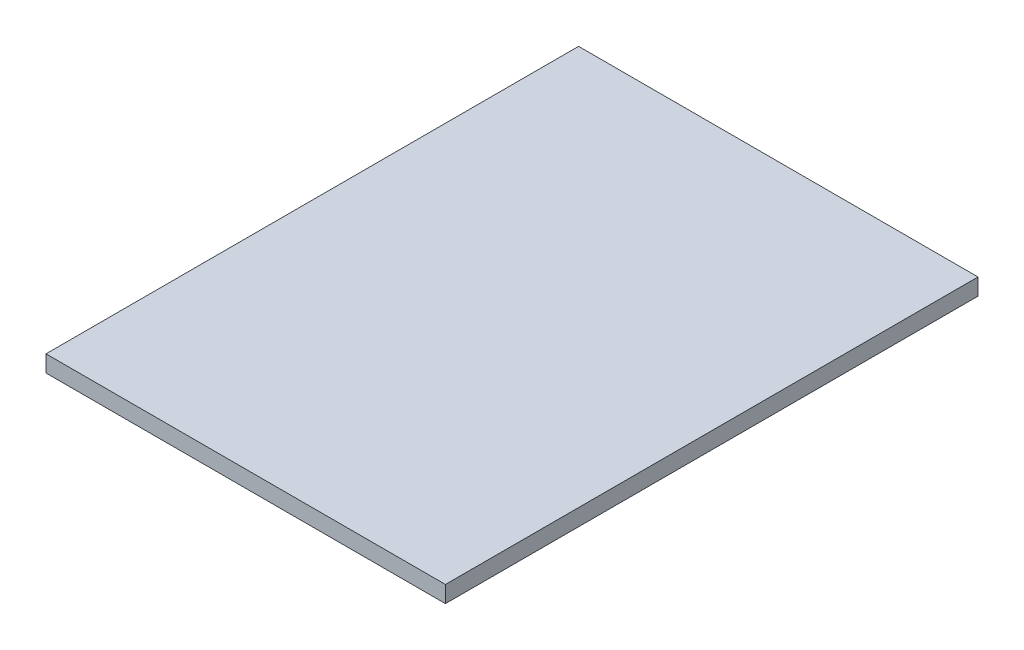
ISO-10303-21;
HEADER;
FILE_DESCRIPTION(('STEP AP214'),'2;1');
FILE_NAME('part.step','',(''),(''),'','','');
FILE_SCHEMA(('AUTOMOTIVE_DESIGN { 1 0 10303 214 1 1 1 1 }'));
ENDSEC;
DATA;
#1=APPLICATION_CONTEXT('core data for automotive mechanical design processes');
#2=APPLICATION_PROTOCOL_DEFINITION('international standard','automotive_design',2000,#1);
#3=PRODUCT_CONTEXT('',#1,'mechanical');
#4=PRODUCT('Part','Part','',(#3));
#5=PRODUCT_RELATED_PRODUCT_CATEGORY('part','',(#4));
#6=PRODUCT_DEFINITION_FORMATION('','',#4);
#7=PRODUCT_DEFINITION_CONTEXT('part definition',#1,'design');
#8=PRODUCT_DEFINITION('design','',#6,#7);
#9=PRODUCT_DEFINITION_SHAPE('','',#8);
#10=(LENGTH_UNIT() NAMED_UNIT(*) SI_UNIT(.MILLI.,.METRE.));
#11=(NAMED_UNIT(*) PLANE_ANGLE_UNIT() SI_UNIT($,.RADIAN.));
#12=(NAMED_UNIT(*) SI_UNIT($,.STERADIAN.) SOLID_ANGLE_UNIT());
#13=UNCERTAINTY_MEASURE_WITH_UNIT(LENGTH_MEASURE(1.E-05),#10,'distance_accuracy_value','');
#14=(GEOMETRIC_REPRESENTATION_CONTEXT(3) GLOBAL_UNCERTAINTY_ASSIGNED_CONTEXT((#13)) GLOBAL_UNIT_ASSIGNED_CONTEXT((#10,
#11,#12)) REPRESENTATION_CONTEXT('',''));
#15=CARTESIAN_POINT('',(0.,0.,0.));
#16=DIRECTION('',(0.,0.,1.));
#17=DIRECTION('',(1.,0.,0.));
#18=AXIS2_PLACEMENT_3D('',#15,#16,#17);
#19=CARTESIAN_POINT('',(114.3,9.525,152.4));
#20=DIRECTION('',(-1.,0.,0.));
#21=DIRECTION('',(0.,0.,1.));
#22=AXIS2_PLACEMENT_3D('',#19,#20,#21);
#23=PLANE('',#22);
#24=DIRECTION('',(0.,0.,-1.));
#25=VECTOR('',#24,1.);
#26=CARTESIAN_POINT('',(114.3,0.,152.4));
#27=LINE('',#26,#25);
#28=CARTESIAN_POINT('',(114.3,0.,152.4));
#29=VERTEX_POINT('',#28);
#30=CARTESIAN_POINT('',(114.3,0.,-152.4));
#31=VERTEX_POINT('',#30);
#32=EDGE_CURVE('E100',#29,#31,#27,.T.);
#33=ORIENTED_EDGE('',*,*,#32,.T.);
#34=DIRECTION('',(0.,-1.,0.));
#35=VECTOR('',#34,1.);
#36=CARTESIAN_POINT('',(114.3,9.525,-152.4));
#37=LINE('',#36,#35);
#38=CARTESIAN_POINT('',(114.3,9.525,-152.4));
#39=VERTEX_POINT('',#38);
#40=EDGE_CURVE('E11',#39,#31,#37,.T.);
#41=ORIENTED_EDGE('',*,*,#40,.F.);
#42=DIRECTION('',(0.,0.,-1.));
#43=VECTOR('',#42,1.);
#44=CARTESIAN_POINT('',(114.3,9.525,152.4));
#45=LINE('',#44,#43);
#46=CARTESIAN_POINT('',(114.3,9.525,152.4));
#47=VERTEX_POINT('',#46);
#48=EDGE_CURVE('E88',#47,#39,#45,.T.);
#49=ORIENTED_EDGE('',*,*,#48,.F.);
#50=DIRECTION('',(0.,-1.,0.));
#51=VECTOR('',#50,1.);
#52=CARTESIAN_POINT('',(114.3,9.525,152.4));
#53=LINE('',#52,#51);
#54=EDGE_CURVE('E96',#47,#29,#53,.T.);
#55=ORIENTED_EDGE('',*,*,#54,.T.);
#56=EDGE_LOOP('',(#33,#41,#49,#55));
#57=FACE_BOUND('',#56,.T.);
#58=ADVANCED_FACE('F37',(#57),#23,.F.);
#59=CARTESIAN_POINT('',(-114.3,9.525,-152.4));
#60=DIRECTION('',(0.,0.,1.));
#61=DIRECTION('',(1.,0.,0.));
#62=AXIS2_PLACEMENT_3D('',#59,#60,#61);
#63=PLANE('',#62);
#64=DIRECTION('',(-1.,0.,0.));
#65=VECTOR('',#64,1.);
#66=CARTESIAN_POINT('',(-114.3,0.,-152.4));
#67=LINE('',#66,#65);
#68=CARTESIAN_POINT('',(-114.3,0.,-152.4));
#69=VERTEX_POINT('',#68);
#70=EDGE_CURVE('E92',#31,#69,#67,.T.);
#71=ORIENTED_EDGE('',*,*,#70,.T.);
#72=DIRECTION('',(0.,-1.,0.));
#73=VECTOR('',#72,1.);
#74=CARTESIAN_POINT('',(-114.3,9.525,-152.4));
#75=LINE('',#74,#73);
#76=CARTESIAN_POINT('',(-114.3,9.525,-152.4));
#77=VERTEX_POINT('',#76);
#78=EDGE_CURVE('E45',#77,#69,#75,.T.);
#79=ORIENTED_EDGE('',*,*,#78,.F.);
#80=DIRECTION('',(-1.,0.,0.));
#81=VECTOR('',#80,1.);
#82=CARTESIAN_POINT('',(-114.3,9.525,-152.4));
#83=LINE('',#82,#81);
#84=EDGE_CURVE('E83',#39,#77,#83,.T.);
#85=ORIENTED_EDGE('',*,*,#84,.F.);
#86=ORIENTED_EDGE('',*,*,#40,.T.);
#87=EDGE_LOOP('',(#71,#79,#85,#86));
#88=FACE_BOUND('',#87,.T.);
#89=ADVANCED_FACE('F91',(#88),#63,.F.);
#90=CARTESIAN_POINT('',(-114.3,9.525,152.4));
#91=DIRECTION('',(1.,0.,0.));
#92=DIRECTION('',(0.,0.,-1.));
#93=AXIS2_PLACEMENT_3D('',#90,#91,#92);
#94=PLANE('',#93);
#95=DIRECTION('',(0.,0.,1.));
#96=VECTOR('',#95,1.);
#97=CARTESIAN_POINT('',(-114.3,0.,152.4));
#98=LINE('',#97,#96);
#99=CARTESIAN_POINT('',(-114.3,0.,152.4));
#100=VERTEX_POINT('',#99);
#101=EDGE_CURVE('E70',#69,#100,#98,.T.);
#102=ORIENTED_EDGE('',*,*,#101,.T.);
#103=DIRECTION('',(0.,-1.,0.));
#104=VECTOR('',#103,1.);
#105=CARTESIAN_POINT('',(-114.3,9.525,152.4));
#106=LINE('',#105,#104);
#107=CARTESIAN_POINT('',(-114.3,9.525,152.4));
#108=VERTEX_POINT('',#107);
#109=EDGE_CURVE('E93',#108,#100,#106,.T.);
#110=ORIENTED_EDGE('',*,*,#109,.F.);
#111=DIRECTION('',(0.,0.,1.));
#112=VECTOR('',#111,1.);
#113=CARTESIAN_POINT('',(-114.3,9.525,152.4));
#114=LINE('',#113,#112);
#115=EDGE_CURVE('E86',#77,#108,#114,.T.);
#116=ORIENTED_EDGE('',*,*,#115,.F.);
#117=ORIENTED_EDGE('',*,*,#78,.T.);
#118=EDGE_LOOP('',(#102,#110,#116,#117));
#119=FACE_BOUND('',#118,.T.);
#120=ADVANCED_FACE('F94',(#119),#94,.F.);
#121=CARTESIAN_POINT('',(-114.3,9.525,152.4));
#122=DIRECTION('',(0.,0.,-1.));
#123=DIRECTION('',(-1.,0.,0.));
#124=AXIS2_PLACEMENT_3D('',#121,#122,#123);
#125=PLANE('',#124);
#126=DIRECTION('',(1.,0.,0.));
#127=VECTOR('',#126,1.);
#128=CARTESIAN_POINT('',(-114.3,0.,152.4));
#129=LINE('',#128,#127);
#130=EDGE_CURVE('E76',#100,#29,#129,.T.);
#131=ORIENTED_EDGE('',*,*,#130,.T.);
#132=ORIENTED_EDGE('',*,*,#54,.F.);
#133=DIRECTION('',(1.,0.,0.));
#134=VECTOR('',#133,1.);
#135=CARTESIAN_POINT('',(-114.3,9.525,152.4));
#136=LINE('',#135,#134);
#137=EDGE_CURVE('E53',#108,#47,#136,.T.);
#138=ORIENTED_EDGE('',*,*,#137,.F.);
#139=ORIENTED_EDGE('',*,*,#109,.T.);
#140=EDGE_LOOP('',(#131,#132,#138,#139));
#141=FACE_BOUND('',#140,.T.);
#142=ADVANCED_FACE('F107',(#141),#125,.F.);
#143=CARTESIAN_POINT('',(0.,9.525,0.));
#144=DIRECTION('',(0.,-1.,0.));
#145=DIRECTION('',(0.,0.,-1.));
#146=AXIS2_PLACEMENT_3D('',#143,#144,#145);
#147=PLANE('',#146);
#148=ORIENTED_EDGE('',*,*,#48,.T.);
#149=ORIENTED_EDGE('',*,*,#84,.T.);
#150=ORIENTED_EDGE('',*,*,#115,.T.);
#151=ORIENTED_EDGE('',*,*,#137,.T.);
#152=EDGE_LOOP('',(#148,#149,#150,#151));
#153=FACE_BOUND('',#152,.T.);
#154=ADVANCED_FACE('F84',(#153),#147,.F.);
#155=CARTESIAN_POINT('',(0.,0.,0.));
#156=DIRECTION('',(0.,-1.,0.));
#157=DIRECTION('',(0.,0.,-1.));
#158=AXIS2_PLACEMENT_3D('',#155,#156,#157);
#159=PLANE('',#158);
#160=ORIENTED_EDGE('',*,*,#32,.F.);
#161=ORIENTED_EDGE('',*,*,#130,.F.);
#162=ORIENTED_EDGE('',*,*,#101,.F.);
#163=ORIENTED_EDGE('',*,*,#70,.F.);
#164=EDGE_LOOP('',(#160,#161,#162,#163));
#165=FACE_BOUND('',#164,.T.);
#166=ADVANCED_FACE('F110',(#165),#159,.T.);
#167=CLOSED_SHELL('',(#58,#89,#120,#142,#154,#166));
#168=MANIFOLD_SOLID_BREP('B2',#167);
#169=ADVANCED_BREP_SHAPE_REPRESENTATION('',(#18,#168),#14);
#170=SHAPE_DEFINITION_REPRESENTATION(#9,#169);
ENDSEC;
END-ISO-10303-21;
